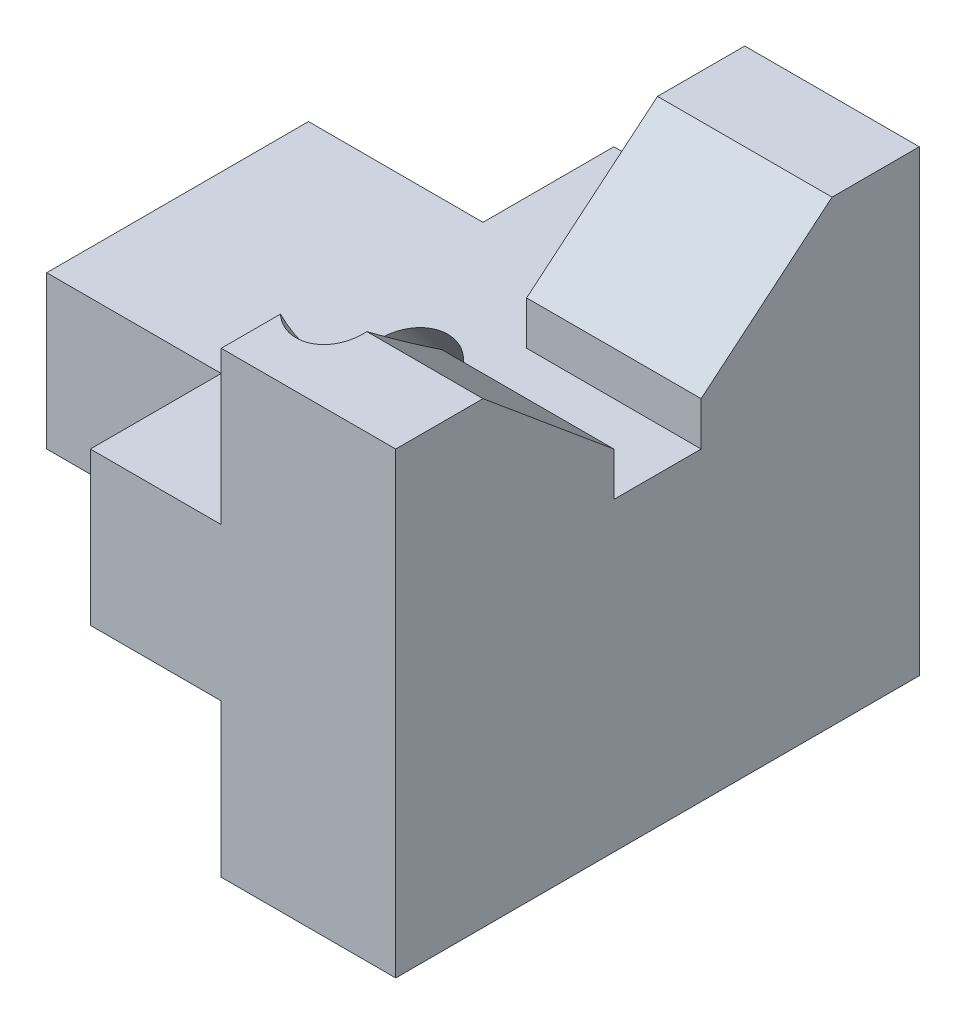
ISO-10303-21;
HEADER;
FILE_DESCRIPTION(('STEP AP214'),'2;1');
FILE_NAME('part.step','',(''),(''),'','','');
FILE_SCHEMA(('AUTOMOTIVE_DESIGN { 1 0 10303 214 1 1 1 1 }'));
ENDSEC;
DATA;
#1=APPLICATION_CONTEXT('core data for automotive mechanical design processes');
#2=APPLICATION_PROTOCOL_DEFINITION('international standard','automotive_design',2000,#1);
#3=PRODUCT_CONTEXT('',#1,'mechanical');
#4=PRODUCT('Part','Part','',(#3));
#5=PRODUCT_RELATED_PRODUCT_CATEGORY('part','',(#4));
#6=PRODUCT_DEFINITION_FORMATION('','',#4);
#7=PRODUCT_DEFINITION_CONTEXT('part definition',#1,'design');
#8=PRODUCT_DEFINITION('design','',#6,#7);
#9=PRODUCT_DEFINITION_SHAPE('','',#8);
#10=(LENGTH_UNIT() NAMED_UNIT(*) SI_UNIT(.MILLI.,.METRE.));
#11=(NAMED_UNIT(*) PLANE_ANGLE_UNIT() SI_UNIT($,.RADIAN.));
#12=(NAMED_UNIT(*) SI_UNIT($,.STERADIAN.) SOLID_ANGLE_UNIT());
#13=UNCERTAINTY_MEASURE_WITH_UNIT(LENGTH_MEASURE(1.E-05),#10,'distance_accuracy_value','');
#14=(GEOMETRIC_REPRESENTATION_CONTEXT(3) GLOBAL_UNCERTAINTY_ASSIGNED_CONTEXT((#13)) GLOBAL_UNIT_ASSIGNED_CONTEXT((#10,
#11,#12)) REPRESENTATION_CONTEXT('',''));
#15=CARTESIAN_POINT('',(0.,0.,0.));
#16=DIRECTION('',(0.,0.,1.));
#17=DIRECTION('',(1.,0.,0.));
#18=AXIS2_PLACEMENT_3D('',#15,#16,#17);
#19=CARTESIAN_POINT('',(0.,0.,0.));
#20=DIRECTION('',(-1.,0.,0.));
#21=DIRECTION('',(0.,0.,1.));
#22=AXIS2_PLACEMENT_3D('',#19,#20,#21);
#23=PLANE('',#22);
#24=DIRECTION('',(0.,0.,1.));
#25=VECTOR('',#24,1.);
#26=CARTESIAN_POINT('',(0.,66.675,25.4));
#27=LINE('',#26,#25);
#28=CARTESIAN_POINT('',(0.,66.675,29.4817574294521));
#29=VERTEX_POINT('',#28);
#30=CARTESIAN_POINT('',(0.,66.675,38.1));
#31=VERTEX_POINT('',#30);
#32=EDGE_CURVE('E273',#29,#31,#27,.T.);
#33=ORIENTED_EDGE('',*,*,#32,.F.);
#34=CARTESIAN_POINT('',(0.,59.794040479712,18.1826302978277));
#35=DIRECTION('',(-1.,0.,0.));
#36=DIRECTION('',(0.,-0.752576694706878,-0.658504607868518));
#37=AXIS2_PLACEMENT_3D('',#34,#35,#36);
#38=ELLIPSE('',#37,18.7387455069477,5.37334310357733);
#39=CARTESIAN_POINT('',(0.,45.3927827138486,6.35000000000001));
#40=VERTEX_POINT('',#39);
#41=EDGE_CURVE('E52',#29,#40,#38,.F.);
#42=ORIENTED_EDGE('',*,*,#41,.T.);
#43=DIRECTION('',(0.,-1.,0.));
#44=VECTOR('',#43,1.);
#45=CARTESIAN_POINT('',(0.,50.8,6.35000000000001));
#46=LINE('',#45,#44);
#47=CARTESIAN_POINT('',(0.,44.45,6.35000000000002));
#48=VERTEX_POINT('',#47);
#49=EDGE_CURVE('E271',#40,#48,#46,.T.);
#50=ORIENTED_EDGE('',*,*,#49,.T.);
#51=DIRECTION('',(0.,0.,-1.));
#52=VECTOR('',#51,1.);
#53=CARTESIAN_POINT('',(0.,44.45,38.1));
#54=LINE('',#53,#52);
#55=CARTESIAN_POINT('',(0.,44.45,38.1));
#56=VERTEX_POINT('',#55);
#57=EDGE_CURVE('E230',#56,#48,#54,.T.);
#58=ORIENTED_EDGE('',*,*,#57,.F.);
#59=DIRECTION('',(0.,-1.,0.));
#60=VECTOR('',#59,1.);
#61=CARTESIAN_POINT('',(0.,66.675,38.1));
#62=LINE('',#61,#60);
#63=EDGE_CURVE('E276',#31,#56,#62,.T.);
#64=ORIENTED_EDGE('',*,*,#63,.F.);
#65=EDGE_LOOP('',(#33,#42,#50,#58,#64));
#66=FACE_BOUND('',#65,.T.);
#67=ADVANCED_FACE('F37',(#66),#23,.T.);
#68=CARTESIAN_POINT('',(0.,22.225,38.1));
#69=VERTEX_POINT('',#68);
#70=CARTESIAN_POINT('',(0.,0.,38.1));
#71=VERTEX_POINT('',#70);
#72=EDGE_CURVE('E275',#69,#71,#62,.T.);
#73=ORIENTED_EDGE('',*,*,#72,.F.);
#74=DIRECTION('',(0.,0.,-1.));
#75=VECTOR('',#74,1.);
#76=CARTESIAN_POINT('',(0.,22.225,6.35000000000001));
#77=LINE('',#76,#75);
#78=CARTESIAN_POINT('',(0.,22.225,-38.1));
#79=VERTEX_POINT('',#78);
#80=EDGE_CURVE('E233',#69,#79,#77,.T.);
#81=ORIENTED_EDGE('',*,*,#80,.T.);
#82=DIRECTION('',(0.,1.,0.));
#83=VECTOR('',#82,1.);
#84=CARTESIAN_POINT('',(0.,0.,-38.1));
#85=LINE('',#84,#83);
#86=CARTESIAN_POINT('',(0.,0.,-38.1));
#87=VERTEX_POINT('',#86);
#88=EDGE_CURVE('E282',#87,#79,#85,.T.);
#89=ORIENTED_EDGE('',*,*,#88,.F.);
#90=DIRECTION('',(0.,0.,-1.));
#91=VECTOR('',#90,1.);
#92=CARTESIAN_POINT('',(0.,0.,38.1));
#93=LINE('',#92,#91);
#94=EDGE_CURVE('E279',#71,#87,#93,.T.);
#95=ORIENTED_EDGE('',*,*,#94,.F.);
#96=EDGE_LOOP('',(#73,#81,#89,#95));
#97=FACE_BOUND('',#96,.T.);
#98=ADVANCED_FACE('F350',(#97),#23,.T.);
#99=CARTESIAN_POINT('',(25.4,50.8,-6.35));
#100=DIRECTION('',(0.,0.,-1.));
#101=DIRECTION('',(0.,1.,0.));
#102=AXIS2_PLACEMENT_3D('',#99,#100,#101);
#103=PLANE('',#102);
#104=DIRECTION('',(0.,-1.,0.));
#105=VECTOR('',#104,1.);
#106=CARTESIAN_POINT('',(0.,50.8,-6.35));
#107=LINE('',#106,#105);
#108=CARTESIAN_POINT('',(0.,50.8,-6.35));
#109=VERTEX_POINT('',#108);
#110=CARTESIAN_POINT('',(0.,44.45,-6.35));
#111=VERTEX_POINT('',#110);
#112=EDGE_CURVE('E236',#109,#111,#107,.T.);
#113=ORIENTED_EDGE('',*,*,#112,.T.);
#114=DIRECTION('',(-1.,0.,0.));
#115=VECTOR('',#114,1.);
#116=CARTESIAN_POINT('',(25.4,44.45,-6.35));
#117=LINE('',#116,#115);
#118=CARTESIAN_POINT('',(25.4,44.45,-6.35));
#119=VERTEX_POINT('',#118);
#120=EDGE_CURVE('E313',#119,#111,#117,.T.);
#121=ORIENTED_EDGE('',*,*,#120,.F.);
#122=DIRECTION('',(0.,-1.,0.));
#123=VECTOR('',#122,1.);
#124=CARTESIAN_POINT('',(25.4,50.8,-6.35));
#125=LINE('',#124,#123);
#126=CARTESIAN_POINT('',(25.4,50.8,-6.35));
#127=VERTEX_POINT('',#126);
#128=EDGE_CURVE('E245',#127,#119,#125,.T.);
#129=ORIENTED_EDGE('',*,*,#128,.F.);
#130=DIRECTION('',(-1.,0.,0.));
#131=VECTOR('',#130,1.);
#132=CARTESIAN_POINT('',(25.4,50.8,-6.35));
#133=LINE('',#132,#131);
#134=EDGE_CURVE('E268',#127,#109,#133,.T.);
#135=ORIENTED_EDGE('',*,*,#134,.T.);
#136=EDGE_LOOP('',(#113,#121,#129,#135));
#137=FACE_BOUND('',#136,.T.);
#138=ADVANCED_FACE('F39',(#137),#103,.F.);
#139=CARTESIAN_POINT('',(25.4,44.45,-6.35));
#140=DIRECTION('',(0.,-1.,0.));
#141=DIRECTION('',(0.,0.,-1.));
#142=AXIS2_PLACEMENT_3D('',#139,#140,#141);
#143=PLANE('',#142);
#144=CARTESIAN_POINT('',(-6.10274337261272,44.45,4.75659487807976));
#145=DIRECTION('',(0.,-1.,0.));
#146=DIRECTION('',(-0.413802944301184,0.,-0.910366477462605));
#147=AXIS2_PLACEMENT_3D('',#144,#145,#146);
#148=ELLIPSE('',#147,7.45291014480874,5.37334310357733);
#149=CARTESIAN_POINT('',(-9.18677953414675,44.45,-2.02828467729509));
#150=VERTEX_POINT('',#149);
#151=EDGE_CURVE('E213',#150,#150,#148,.F.);
#152=ORIENTED_EDGE('',*,*,#151,.F.);
#153=EDGE_LOOP('',(#152));
#154=FACE_BOUND('',#153,.T.);
#155=ORIENTED_EDGE('',*,*,#120,.T.);
#156=CARTESIAN_POINT('',(0.,44.45,-38.1));
#157=VERTEX_POINT('',#156);
#158=EDGE_CURVE('E45',#111,#157,#54,.T.);
#159=ORIENTED_EDGE('',*,*,#158,.T.);
#160=DIRECTION('',(-1.,0.,0.));
#161=VECTOR('',#160,1.);
#162=CARTESIAN_POINT('',(0.,44.45,-38.1));
#163=LINE('',#162,#161);
#164=CARTESIAN_POINT('',(-19.05,44.45,-38.1));
#165=VERTEX_POINT('',#164);
#166=EDGE_CURVE('E209',#157,#165,#163,.T.);
#167=ORIENTED_EDGE('',*,*,#166,.T.);
#168=DIRECTION('',(0.,0.,1.));
#169=VECTOR('',#168,1.);
#170=CARTESIAN_POINT('',(-19.05,44.45,-38.1));
#171=LINE('',#170,#169);
#172=CARTESIAN_POINT('',(-19.05,44.45,-19.05));
#173=VERTEX_POINT('',#172);
#174=EDGE_CURVE('E212',#165,#173,#171,.T.);
#175=ORIENTED_EDGE('',*,*,#174,.T.);
#176=DIRECTION('',(-1.,0.,0.));
#177=VECTOR('',#176,1.);
#178=CARTESIAN_POINT('',(-19.05,44.45,-19.05));
#179=LINE('',#178,#177);
#180=CARTESIAN_POINT('',(-44.45,44.45,-19.05));
#181=VERTEX_POINT('',#180);
#182=EDGE_CURVE('E216',#173,#181,#179,.T.);
#183=ORIENTED_EDGE('',*,*,#182,.T.);
#184=DIRECTION('',(0.,0.,1.));
#185=VECTOR('',#184,1.);
#186=CARTESIAN_POINT('',(-44.45,44.45,-19.05));
#187=LINE('',#186,#185);
#188=CARTESIAN_POINT('',(-44.45,44.45,19.05));
#189=VERTEX_POINT('',#188);
#190=EDGE_CURVE('E219',#181,#189,#187,.T.);
#191=ORIENTED_EDGE('',*,*,#190,.T.);
#192=DIRECTION('',(1.,0.,0.));
#193=VECTOR('',#192,1.);
#194=CARTESIAN_POINT('',(-44.45,44.45,19.05));
#195=LINE('',#194,#193);
#196=CARTESIAN_POINT('',(-19.05,44.45,19.05));
#197=VERTEX_POINT('',#196);
#198=EDGE_CURVE('E222',#189,#197,#195,.T.);
#199=ORIENTED_EDGE('',*,*,#198,.T.);
#200=DIRECTION('',(0.,0.,1.));
#201=VECTOR('',#200,1.);
#202=CARTESIAN_POINT('',(-19.05,44.45,19.05));
#203=LINE('',#202,#201);
#204=CARTESIAN_POINT('',(-19.05,44.45,38.1));
#205=VERTEX_POINT('',#204);
#206=EDGE_CURVE('E225',#197,#205,#203,.T.);
#207=ORIENTED_EDGE('',*,*,#206,.T.);
#208=DIRECTION('',(1.,0.,0.));
#209=VECTOR('',#208,1.);
#210=CARTESIAN_POINT('',(-19.05,44.45,38.1));
#211=LINE('',#210,#209);
#212=EDGE_CURVE('E228',#205,#56,#211,.T.);
#213=ORIENTED_EDGE('',*,*,#212,.T.);
#214=ORIENTED_EDGE('',*,*,#57,.T.);
#215=DIRECTION('',(-1.,0.,0.));
#216=VECTOR('',#215,1.);
#217=CARTESIAN_POINT('',(25.4,44.45,6.35000000000001));
#218=LINE('',#217,#216);
#219=CARTESIAN_POINT('',(25.4,44.45,6.35000000000001));
#220=VERTEX_POINT('',#219);
#221=EDGE_CURVE('E311',#220,#48,#218,.T.);
#222=ORIENTED_EDGE('',*,*,#221,.F.);
#223=DIRECTION('',(0.,0.,1.));
#224=VECTOR('',#223,1.);
#225=CARTESIAN_POINT('',(25.4,44.45,-6.35));
#226=LINE('',#225,#224);
#227=EDGE_CURVE('E248',#119,#220,#226,.T.);
#228=ORIENTED_EDGE('',*,*,#227,.F.);
#229=EDGE_LOOP('',(#155,#159,#167,#175,#183,#191,#199,#207,#213,#214,#222,#228));
#230=FACE_BOUND('',#229,.T.);
#231=ADVANCED_FACE('F318',(#154,#230),#143,.F.);
#232=CARTESIAN_POINT('',(25.4,50.8,6.35000000000001));
#233=DIRECTION('',(0.,0.,-1.));
#234=DIRECTION('',(0.,1.,0.));
#235=AXIS2_PLACEMENT_3D('',#232,#233,#234);
#236=PLANE('',#235);
#237=ORIENTED_EDGE('',*,*,#49,.F.);
#238=CARTESIAN_POINT('',(-5.37846831719442,46.2710344250517,6.35000000000001));
#239=DIRECTION('',(0.,0.,-1.));
#240=DIRECTION('',(-0.369569423386455,-0.929203121657371,0.));
#241=AXIS2_PLACEMENT_3D('',#238,#239,#240);
#242=ELLIPSE('',#241,8.51761159406714,5.37334310357733);
#243=CARTESIAN_POINT('',(0.307390266295636,50.8,6.35000000000001));
#244=VERTEX_POINT('',#243);
#245=EDGE_CURVE('E357',#40,#244,#242,.F.);
#246=ORIENTED_EDGE('',*,*,#245,.T.);
#247=DIRECTION('',(-1.,0.,0.));
#248=VECTOR('',#247,1.);
#249=CARTESIAN_POINT('',(25.4,50.8,6.35000000000001));
#250=LINE('',#249,#248);
#251=CARTESIAN_POINT('',(25.4,50.8,6.35000000000001));
#252=VERTEX_POINT('',#251);
#253=EDGE_CURVE('E308',#252,#244,#250,.T.);
#254=ORIENTED_EDGE('',*,*,#253,.F.);
#255=DIRECTION('',(0.,-1.,0.));
#256=VECTOR('',#255,1.);
#257=CARTESIAN_POINT('',(25.4,50.8,6.35000000000001));
#258=LINE('',#257,#256);
#259=EDGE_CURVE('E251',#252,#220,#258,.T.);
#260=ORIENTED_EDGE('',*,*,#259,.T.);
#261=ORIENTED_EDGE('',*,*,#221,.T.);
#262=EDGE_LOOP('',(#237,#246,#254,#260,#261));
#263=FACE_BOUND('',#262,.T.);
#264=ADVANCED_FACE('F387',(#263),#236,.T.);
#265=CARTESIAN_POINT('',(25.4,50.8,6.35000000000001));
#266=DIRECTION('',(0.,-0.768221279597376,0.64018439966448));
#267=DIRECTION('',(0.,-0.64018439966448,-0.768221279597376));
#268=AXIS2_PLACEMENT_3D('',#265,#266,#267);
#269=PLANE('',#268);
#270=CARTESIAN_POINT('',(1.27246014951285,62.99336885563,20.982042626756));
#271=DIRECTION('',(0.,-0.768221279597376,0.64018439966448));
#272=DIRECTION('',(-0.290032083068366,-0.612667304280249,-0.735200765136298));
#273=AXIS2_PLACEMENT_3D('',#270,#271,#272);
#274=ELLIPSE('',#273,35.8209778726486,5.37334310357733);
#275=CARTESIAN_POINT('',(8.5021513684681,66.675,25.4));
#276=VERTEX_POINT('',#275);
#277=EDGE_CURVE('E360',#276,#244,#274,.F.);
#278=ORIENTED_EDGE('',*,*,#277,.F.);
#279=DIRECTION('',(-1.,0.,0.));
#280=VECTOR('',#279,1.);
#281=CARTESIAN_POINT('',(25.4,66.675,25.4));
#282=LINE('',#281,#280);
#283=CARTESIAN_POINT('',(25.4,66.675,25.4));
#284=VERTEX_POINT('',#283);
#285=EDGE_CURVE('E305',#284,#276,#282,.T.);
#286=ORIENTED_EDGE('',*,*,#285,.F.);
#287=DIRECTION('',(0.,0.64018439966448,0.768221279597376));
#288=VECTOR('',#287,1.);
#289=CARTESIAN_POINT('',(25.4,50.8,6.35000000000001));
#290=LINE('',#289,#288);
#291=EDGE_CURVE('E254',#252,#284,#290,.T.);
#292=ORIENTED_EDGE('',*,*,#291,.F.);
#293=ORIENTED_EDGE('',*,*,#253,.T.);
#294=EDGE_LOOP('',(#278,#286,#292,#293));
#295=FACE_BOUND('',#294,.T.);
#296=ADVANCED_FACE('F394',(#295),#269,.F.);
#297=CARTESIAN_POINT('',(25.4,66.675,25.4));
#298=DIRECTION('',(0.,-1.,0.));
#299=DIRECTION('',(0.,0.,-1.));
#300=AXIS2_PLACEMENT_3D('',#297,#298,#299);
#301=PLANE('',#300);
#302=CARTESIAN_POINT('',(2.73674526375092,66.675,24.2034698780798));
#303=DIRECTION('',(0.,-1.,0.));
#304=DIRECTION('',(-0.413802944301185,0.,-0.910366477462604));
#305=AXIS2_PLACEMENT_3D('',#302,#303,#304);
#306=ELLIPSE('',#305,7.45291014480874,5.37334310357733);
#307=EDGE_CURVE('E185',#29,#276,#306,.F.);
#308=ORIENTED_EDGE('',*,*,#307,.F.);
#309=ORIENTED_EDGE('',*,*,#32,.T.);
#310=DIRECTION('',(-1.,0.,0.));
#311=VECTOR('',#310,1.);
#312=CARTESIAN_POINT('',(25.4,66.675,38.1));
#313=LINE('',#312,#311);
#314=CARTESIAN_POINT('',(25.4,66.675,38.1));
#315=VERTEX_POINT('',#314);
#316=EDGE_CURVE('E302',#315,#31,#313,.T.);
#317=ORIENTED_EDGE('',*,*,#316,.F.);
#318=DIRECTION('',(0.,0.,1.));
#319=VECTOR('',#318,1.);
#320=CARTESIAN_POINT('',(25.4,66.675,25.4));
#321=LINE('',#320,#319);
#322=EDGE_CURVE('E256',#284,#315,#321,.T.);
#323=ORIENTED_EDGE('',*,*,#322,.F.);
#324=ORIENTED_EDGE('',*,*,#285,.T.);
#325=EDGE_LOOP('',(#308,#309,#317,#323,#324));
#326=FACE_BOUND('',#325,.T.);
#327=ADVANCED_FACE('F396',(#326),#301,.F.);
#328=CARTESIAN_POINT('',(25.4,66.675,38.1));
#329=DIRECTION('',(0.,0.,-1.));
#330=DIRECTION('',(-1.,0.,0.));
#331=AXIS2_PLACEMENT_3D('',#328,#329,#330);
#332=PLANE('',#331);
#333=ORIENTED_EDGE('',*,*,#63,.T.);
#334=ORIENTED_EDGE('',*,*,#212,.F.);
#335=DIRECTION('',(0.,1.,0.));
#336=VECTOR('',#335,1.);
#337=CARTESIAN_POINT('',(-19.05,22.225,38.1));
#338=LINE('',#337,#336);
#339=CARTESIAN_POINT('',(-19.05,22.225,38.1));
#340=VERTEX_POINT('',#339);
#341=EDGE_CURVE('E234',#340,#205,#338,.T.);
#342=ORIENTED_EDGE('',*,*,#341,.F.);
#343=DIRECTION('',(1.,0.,0.));
#344=VECTOR('',#343,1.);
#345=CARTESIAN_POINT('',(-19.05,22.225,38.1));
#346=LINE('',#345,#344);
#347=EDGE_CURVE('E205',#340,#69,#346,.T.);
#348=ORIENTED_EDGE('',*,*,#347,.T.);
#349=ORIENTED_EDGE('',*,*,#72,.T.);
#350=DIRECTION('',(-1.,0.,0.));
#351=VECTOR('',#350,1.);
#352=CARTESIAN_POINT('',(25.4,0.,38.1));
#353=LINE('',#352,#351);
#354=CARTESIAN_POINT('',(25.4,0.,38.1));
#355=VERTEX_POINT('',#354);
#356=EDGE_CURVE('E299',#355,#71,#353,.T.);
#357=ORIENTED_EDGE('',*,*,#356,.F.);
#358=DIRECTION('',(0.,-1.,0.));
#359=VECTOR('',#358,1.);
#360=CARTESIAN_POINT('',(25.4,66.675,38.1));
#361=LINE('',#360,#359);
#362=EDGE_CURVE('E258',#315,#355,#361,.T.);
#363=ORIENTED_EDGE('',*,*,#362,.F.);
#364=ORIENTED_EDGE('',*,*,#316,.T.);
#365=EDGE_LOOP('',(#333,#334,#342,#348,#349,#357,#363,#364));
#366=FACE_BOUND('',#365,.T.);
#367=ADVANCED_FACE('F378',(#366),#332,.F.);
#368=CARTESIAN_POINT('',(25.4,0.,38.1));
#369=DIRECTION('',(0.,1.,0.));
#370=DIRECTION('',(0.,0.,1.));
#371=AXIS2_PLACEMENT_3D('',#368,#369,#370);
#372=PLANE('',#371);
#373=ORIENTED_EDGE('',*,*,#94,.T.);
#374=DIRECTION('',(-1.,0.,0.));
#375=VECTOR('',#374,1.);
#376=CARTESIAN_POINT('',(25.4,0.,-38.1));
#377=LINE('',#376,#375);
#378=CARTESIAN_POINT('',(25.4,0.,-38.1));
#379=VERTEX_POINT('',#378);
#380=EDGE_CURVE('E296',#379,#87,#377,.T.);
#381=ORIENTED_EDGE('',*,*,#380,.F.);
#382=DIRECTION('',(0.,0.,-1.));
#383=VECTOR('',#382,1.);
#384=CARTESIAN_POINT('',(25.4,0.,38.1));
#385=LINE('',#384,#383);
#386=EDGE_CURVE('E260',#355,#379,#385,.T.);
#387=ORIENTED_EDGE('',*,*,#386,.F.);
#388=ORIENTED_EDGE('',*,*,#356,.T.);
#389=EDGE_LOOP('',(#373,#381,#387,#388));
#390=FACE_BOUND('',#389,.T.);
#391=ADVANCED_FACE('F398',(#390),#372,.F.);
#392=CARTESIAN_POINT('',(25.4,0.,-38.1));
#393=DIRECTION('',(0.,0.,1.));
#394=DIRECTION('',(1.,0.,0.));
#395=AXIS2_PLACEMENT_3D('',#392,#393,#394);
#396=PLANE('',#395);
#397=ORIENTED_EDGE('',*,*,#88,.T.);
#398=DIRECTION('',(-1.,0.,0.));
#399=VECTOR('',#398,1.);
#400=CARTESIAN_POINT('',(0.,22.225,-38.1));
#401=LINE('',#400,#399);
#402=CARTESIAN_POINT('',(-19.05,22.225,-38.1));
#403=VERTEX_POINT('',#402);
#404=EDGE_CURVE('E196',#79,#403,#401,.T.);
#405=ORIENTED_EDGE('',*,*,#404,.T.);
#406=DIRECTION('',(0.,1.,0.));
#407=VECTOR('',#406,1.);
#408=CARTESIAN_POINT('',(-19.05,22.225,-38.1));
#409=LINE('',#408,#407);
#410=EDGE_CURVE('E208',#403,#165,#409,.T.);
#411=ORIENTED_EDGE('',*,*,#410,.T.);
#412=ORIENTED_EDGE('',*,*,#166,.F.);
#413=CARTESIAN_POINT('',(0.,66.675,-38.1));
#414=VERTEX_POINT('',#413);
#415=EDGE_CURVE('E281',#157,#414,#85,.T.);
#416=ORIENTED_EDGE('',*,*,#415,.T.);
#417=DIRECTION('',(-1.,0.,0.));
#418=VECTOR('',#417,1.);
#419=CARTESIAN_POINT('',(25.4,66.675,-38.1));
#420=LINE('',#419,#418);
#421=CARTESIAN_POINT('',(25.4,66.675,-38.1));
#422=VERTEX_POINT('',#421);
#423=EDGE_CURVE('E293',#422,#414,#420,.T.);
#424=ORIENTED_EDGE('',*,*,#423,.F.);
#425=DIRECTION('',(0.,1.,0.));
#426=VECTOR('',#425,1.);
#427=CARTESIAN_POINT('',(25.4,0.,-38.1));
#428=LINE('',#427,#426);
#429=EDGE_CURVE('E262',#379,#422,#428,.T.);
#430=ORIENTED_EDGE('',*,*,#429,.F.);
#431=ORIENTED_EDGE('',*,*,#380,.T.);
#432=EDGE_LOOP('',(#397,#405,#411,#412,#416,#424,#430,#431));
#433=FACE_BOUND('',#432,.T.);
#434=ADVANCED_FACE('F323',(#433),#396,.F.);
#435=CARTESIAN_POINT('',(25.4,66.675,-38.1));
#436=DIRECTION('',(0.,-1.,0.));
#437=DIRECTION('',(0.,0.,-1.));
#438=AXIS2_PLACEMENT_3D('',#435,#436,#437);
#439=PLANE('',#438);
#440=DIRECTION('',(0.,0.,1.));
#441=VECTOR('',#440,1.);
#442=CARTESIAN_POINT('',(0.,66.675,-38.1));
#443=LINE('',#442,#441);
#444=CARTESIAN_POINT('',(0.,66.675,-25.4));
#445=VERTEX_POINT('',#444);
#446=EDGE_CURVE('E285',#414,#445,#443,.T.);
#447=ORIENTED_EDGE('',*,*,#446,.T.);
#448=DIRECTION('',(-1.,0.,0.));
#449=VECTOR('',#448,1.);
#450=CARTESIAN_POINT('',(25.4,66.675,-25.4));
#451=LINE('',#450,#449);
#452=CARTESIAN_POINT('',(25.4,66.675,-25.4));
#453=VERTEX_POINT('',#452);
#454=EDGE_CURVE('E290',#453,#445,#451,.T.);
#455=ORIENTED_EDGE('',*,*,#454,.F.);
#456=DIRECTION('',(0.,0.,1.));
#457=VECTOR('',#456,1.);
#458=CARTESIAN_POINT('',(25.4,66.675,-38.1));
#459=LINE('',#458,#457);
#460=EDGE_CURVE('E264',#422,#453,#459,.T.);
#461=ORIENTED_EDGE('',*,*,#460,.F.);
#462=ORIENTED_EDGE('',*,*,#423,.T.);
#463=EDGE_LOOP('',(#447,#455,#461,#462));
#464=FACE_BOUND('',#463,.T.);
#465=ADVANCED_FACE('F332',(#464),#439,.F.);
#466=CARTESIAN_POINT('',(25.4,66.675,-25.4));
#467=DIRECTION('',(0.,-0.768221279597377,-0.640184399664479));
#468=DIRECTION('',(0.,0.640184399664479,-0.768221279597377));
#469=AXIS2_PLACEMENT_3D('',#466,#467,#468);
#470=PLANE('',#469);
#471=DIRECTION('',(0.,-0.640184399664479,0.768221279597376));
#472=VECTOR('',#471,1.);
#473=CARTESIAN_POINT('',(0.,66.675,-25.4));
#474=LINE('',#473,#472);
#475=EDGE_CURVE('E249',#445,#109,#474,.T.);
#476=ORIENTED_EDGE('',*,*,#475,.T.);
#477=ORIENTED_EDGE('',*,*,#134,.F.);
#478=DIRECTION('',(0.,-0.640184399664479,0.768221279597376));
#479=VECTOR('',#478,1.);
#480=CARTESIAN_POINT('',(25.4,66.675,-25.4));
#481=LINE('',#480,#479);
#482=EDGE_CURVE('E266',#453,#127,#481,.T.);
#483=ORIENTED_EDGE('',*,*,#482,.F.);
#484=ORIENTED_EDGE('',*,*,#454,.T.);
#485=EDGE_LOOP('',(#476,#477,#483,#484));
#486=FACE_BOUND('',#485,.T.);
#487=ADVANCED_FACE('F336',(#486),#470,.F.);
#488=CARTESIAN_POINT('',(25.4,0.,0.));
#489=DIRECTION('',(-1.,0.,0.));
#490=DIRECTION('',(0.,0.,1.));
#491=AXIS2_PLACEMENT_3D('',#488,#489,#490);
#492=PLANE('',#491);
#493=ORIENTED_EDGE('',*,*,#128,.T.);
#494=ORIENTED_EDGE('',*,*,#227,.T.);
#495=ORIENTED_EDGE('',*,*,#259,.F.);
#496=ORIENTED_EDGE('',*,*,#291,.T.);
#497=ORIENTED_EDGE('',*,*,#322,.T.);
#498=ORIENTED_EDGE('',*,*,#362,.T.);
#499=ORIENTED_EDGE('',*,*,#386,.T.);
#500=ORIENTED_EDGE('',*,*,#429,.T.);
#501=ORIENTED_EDGE('',*,*,#460,.T.);
#502=ORIENTED_EDGE('',*,*,#482,.T.);
#503=EDGE_LOOP('',(#493,#494,#495,#496,#497,#498,#499,#500,#501,#502));
#504=FACE_BOUND('',#503,.T.);
#505=ADVANCED_FACE('F340',(#504),#492,.F.);
#506=ORIENTED_EDGE('',*,*,#158,.F.);
#507=ORIENTED_EDGE('',*,*,#112,.F.);
#508=ORIENTED_EDGE('',*,*,#475,.F.);
#509=ORIENTED_EDGE('',*,*,#446,.F.);
#510=ORIENTED_EDGE('',*,*,#415,.F.);
#511=EDGE_LOOP('',(#506,#507,#508,#509,#510));
#512=FACE_BOUND('',#511,.T.);
#513=ADVANCED_FACE('F328',(#512),#23,.T.);
#514=CARTESIAN_POINT('',(-19.05,22.225,19.05));
#515=DIRECTION('',(-1.,0.,0.));
#516=DIRECTION('',(0.,0.,1.));
#517=AXIS2_PLACEMENT_3D('',#514,#515,#516);
#518=PLANE('',#517);
#519=ORIENTED_EDGE('',*,*,#206,.F.);
#520=DIRECTION('',(0.,1.,0.));
#521=VECTOR('',#520,1.);
#522=CARTESIAN_POINT('',(-19.05,22.225,19.05));
#523=LINE('',#522,#521);
#524=CARTESIAN_POINT('',(-19.05,22.225,19.05));
#525=VERTEX_POINT('',#524);
#526=EDGE_CURVE('E237',#525,#197,#523,.T.);
#527=ORIENTED_EDGE('',*,*,#526,.F.);
#528=DIRECTION('',(0.,0.,1.));
#529=VECTOR('',#528,1.);
#530=CARTESIAN_POINT('',(-19.05,22.225,19.05));
#531=LINE('',#530,#529);
#532=EDGE_CURVE('E202',#525,#340,#531,.T.);
#533=ORIENTED_EDGE('',*,*,#532,.T.);
#534=ORIENTED_EDGE('',*,*,#341,.T.);
#535=EDGE_LOOP('',(#519,#527,#533,#534));
#536=FACE_BOUND('',#535,.T.);
#537=ADVANCED_FACE('F375',(#536),#518,.T.);
#538=CARTESIAN_POINT('',(-44.45,22.225,19.05));
#539=DIRECTION('',(0.,0.,1.));
#540=DIRECTION('',(1.,0.,0.));
#541=AXIS2_PLACEMENT_3D('',#538,#539,#540);
#542=PLANE('',#541);
#543=ORIENTED_EDGE('',*,*,#198,.F.);
#544=DIRECTION('',(0.,1.,0.));
#545=VECTOR('',#544,1.);
#546=CARTESIAN_POINT('',(-44.45,22.225,19.05));
#547=LINE('',#546,#545);
#548=CARTESIAN_POINT('',(-44.45,22.225,19.05));
#549=VERTEX_POINT('',#548);
#550=EDGE_CURVE('E239',#549,#189,#547,.T.);
#551=ORIENTED_EDGE('',*,*,#550,.F.);
#552=DIRECTION('',(1.,0.,0.));
#553=VECTOR('',#552,1.);
#554=CARTESIAN_POINT('',(-44.45,22.225,19.05));
#555=LINE('',#554,#553);
#556=EDGE_CURVE('E194',#549,#525,#555,.T.);
#557=ORIENTED_EDGE('',*,*,#556,.T.);
#558=ORIENTED_EDGE('',*,*,#526,.T.);
#559=EDGE_LOOP('',(#543,#551,#557,#558));
#560=FACE_BOUND('',#559,.T.);
#561=ADVANCED_FACE('F370',(#560),#542,.T.);
#562=CARTESIAN_POINT('',(-44.45,22.225,-19.05));
#563=DIRECTION('',(-1.,0.,0.));
#564=DIRECTION('',(0.,0.,1.));
#565=AXIS2_PLACEMENT_3D('',#562,#563,#564);
#566=PLANE('',#565);
#567=ORIENTED_EDGE('',*,*,#190,.F.);
#568=DIRECTION('',(0.,1.,0.));
#569=VECTOR('',#568,1.);
#570=CARTESIAN_POINT('',(-44.45,22.225,-19.05));
#571=LINE('',#570,#569);
#572=CARTESIAN_POINT('',(-44.45,22.225,-19.05));
#573=VERTEX_POINT('',#572);
#574=EDGE_CURVE('E241',#573,#181,#571,.T.);
#575=ORIENTED_EDGE('',*,*,#574,.F.);
#576=DIRECTION('',(0.,0.,1.));
#577=VECTOR('',#576,1.);
#578=CARTESIAN_POINT('',(-44.45,22.225,-19.05));
#579=LINE('',#578,#577);
#580=EDGE_CURVE('E191',#573,#549,#579,.T.);
#581=ORIENTED_EDGE('',*,*,#580,.T.);
#582=ORIENTED_EDGE('',*,*,#550,.T.);
#583=EDGE_LOOP('',(#567,#575,#581,#582));
#584=FACE_BOUND('',#583,.T.);
#585=ADVANCED_FACE('F367',(#584),#566,.T.);
#586=CARTESIAN_POINT('',(-19.05,22.225,-19.05));
#587=DIRECTION('',(0.,0.,-1.));
#588=DIRECTION('',(-1.,0.,0.));
#589=AXIS2_PLACEMENT_3D('',#586,#587,#588);
#590=PLANE('',#589);
#591=DIRECTION('',(0.,1.,0.));
#592=VECTOR('',#591,1.);
#593=CARTESIAN_POINT('',(-19.05,22.225,-19.05));
#594=LINE('',#593,#592);
#595=CARTESIAN_POINT('',(-19.05,23.5607607750636,-19.05));
#596=VERTEX_POINT('',#595);
#597=EDGE_CURVE('E184',#596,#173,#594,.T.);
#598=ORIENTED_EDGE('',*,*,#597,.F.);
#599=CARTESIAN_POINT('',(-16.923922862649,17.2424629964803,-19.05));
#600=DIRECTION('',(0.,0.,-1.));
#601=DIRECTION('',(-0.369569423386454,-0.929203121657371,0.));
#602=AXIS2_PLACEMENT_3D('',#599,#600,#601);
#603=ELLIPSE('',#602,8.51761159406714,5.37334310357733);
#604=CARTESIAN_POINT('',(-20.2433976433892,22.225,-19.05));
#605=VERTEX_POINT('',#604);
#606=EDGE_CURVE('E173',#596,#605,#603,.F.);
#607=ORIENTED_EDGE('',*,*,#606,.T.);
#608=DIRECTION('',(-1.,0.,0.));
#609=VECTOR('',#608,1.);
#610=CARTESIAN_POINT('',(-19.05,22.225,-19.05));
#611=LINE('',#610,#609);
#612=EDGE_CURVE('E181',#605,#573,#611,.T.);
#613=ORIENTED_EDGE('',*,*,#612,.T.);
#614=ORIENTED_EDGE('',*,*,#574,.T.);
#615=ORIENTED_EDGE('',*,*,#182,.F.);
#616=EDGE_LOOP('',(#598,#607,#613,#614,#615));
#617=FACE_BOUND('',#616,.T.);
#618=ADVANCED_FACE('F180',(#617),#590,.T.);
#619=CARTESIAN_POINT('',(-19.05,22.225,-38.1));
#620=DIRECTION('',(-1.,0.,0.));
#621=DIRECTION('',(0.,0.,1.));
#622=AXIS2_PLACEMENT_3D('',#619,#620,#621);
#623=PLANE('',#622);
#624=DIRECTION('',(0.,0.,1.));
#625=VECTOR('',#624,1.);
#626=CARTESIAN_POINT('',(-19.05,22.225,-38.1));
#627=LINE('',#626,#625);
#628=CARTESIAN_POINT('',(-19.05,22.225,-20.7989242399396));
#629=VERTEX_POINT('',#628);
#630=EDGE_CURVE('E192',#403,#629,#627,.T.);
#631=ORIENTED_EDGE('',*,*,#630,.T.);
#632=CARTESIAN_POINT('',(-19.05,11.8968976225691,-23.7273697021723));
#633=DIRECTION('',(-1.,0.,0.));
#634=DIRECTION('',(0.,-0.752576694706878,-0.658504607868518));
#635=AXIS2_PLACEMENT_3D('',#632,#633,#634);
#636=ELLIPSE('',#635,18.7387455069477,5.37334310357733);
#637=EDGE_CURVE('E59',#629,#596,#636,.F.);
#638=ORIENTED_EDGE('',*,*,#637,.T.);
#639=ORIENTED_EDGE('',*,*,#597,.T.);
#640=ORIENTED_EDGE('',*,*,#174,.F.);
#641=ORIENTED_EDGE('',*,*,#410,.F.);
#642=EDGE_LOOP('',(#631,#638,#639,#640,#641));
#643=FACE_BOUND('',#642,.T.);
#644=ADVANCED_FACE('F364',(#643),#623,.T.);
#645=CARTESIAN_POINT('',(0.,22.225,0.));
#646=DIRECTION('',(0.,1.,0.));
#647=DIRECTION('',(0.,0.,1.));
#648=AXIS2_PLACEMENT_3D('',#645,#646,#647);
#649=PLANE('',#648);
#650=CARTESIAN_POINT('',(-14.9422320089764,22.225,-14.6902801219202));
#651=DIRECTION('',(0.,1.,0.));
#652=DIRECTION('',(-0.413802944301184,0.,-0.910366477462605));
#653=AXIS2_PLACEMENT_3D('',#650,#651,#652);
#654=ELLIPSE('',#653,7.45291014480874,5.37334310357733);
#655=EDGE_CURVE('E11',#629,#605,#654,.F.);
#656=ORIENTED_EDGE('',*,*,#655,.F.);
#657=ORIENTED_EDGE('',*,*,#630,.F.);
#658=ORIENTED_EDGE('',*,*,#404,.F.);
#659=ORIENTED_EDGE('',*,*,#80,.F.);
#660=ORIENTED_EDGE('',*,*,#347,.F.);
#661=ORIENTED_EDGE('',*,*,#532,.F.);
#662=ORIENTED_EDGE('',*,*,#556,.F.);
#663=ORIENTED_EDGE('',*,*,#580,.F.);
#664=ORIENTED_EDGE('',*,*,#612,.F.);
#665=EDGE_LOOP('',(#656,#657,#658,#659,#660,#661,#662,#663,#664));
#666=FACE_BOUND('',#665,.T.);
#667=ADVANCED_FACE('F188',(#666),#649,.F.);
#668=CARTESIAN_POINT('',(10.7190156474491,86.7447083932982,41.7644647222156));
#669=DIRECTION('',(-0.286750417821998,-0.720972479095308,-0.630850919208394));
#670=DIRECTION('',(0.,0.658504607868518,-0.752576694706878));
#671=AXIS2_PLACEMENT_3D('',#668,#669,#670);
#672=CYLINDRICAL_SURFACE('',#671,5.37334310357733);
#673=ORIENTED_EDGE('',*,*,#637,.F.);
#674=ORIENTED_EDGE('',*,*,#655,.T.);
#675=ORIENTED_EDGE('',*,*,#606,.F.);
#676=EDGE_LOOP('',(#673,#674,#675));
#677=FACE_BOUND('',#676,.T.);
#678=ORIENTED_EDGE('',*,*,#151,.T.);
#679=EDGE_LOOP('',(#678));
#680=FACE_BOUND('',#679,.T.);
#681=ADVANCED_FACE('F171',(#677,#680),#672,.F.);
#682=ORIENTED_EDGE('',*,*,#307,.T.);
#683=ORIENTED_EDGE('',*,*,#277,.T.);
#684=ORIENTED_EDGE('',*,*,#245,.F.);
#685=ORIENTED_EDGE('',*,*,#41,.F.);
#686=EDGE_LOOP('',(#682,#683,#684,#685));
#687=FACE_BOUND('',#686,.T.);
#688=ADVANCED_FACE('F434',(#687),#672,.F.);
#689=CLOSED_SHELL('',(#67,#98,#138,#231,#264,#296,#327,#367,#391,#434,#465,#487,#505,#513,#537,
#561,#585,#618,#644,#667,#681,#688));
#690=MANIFOLD_SOLID_BREP('B2',#689);
#691=ADVANCED_BREP_SHAPE_REPRESENTATION('',(#18,#690),#14);
#692=SHAPE_DEFINITION_REPRESENTATION(#9,#691);
ENDSEC;
END-ISO-10303-21;
